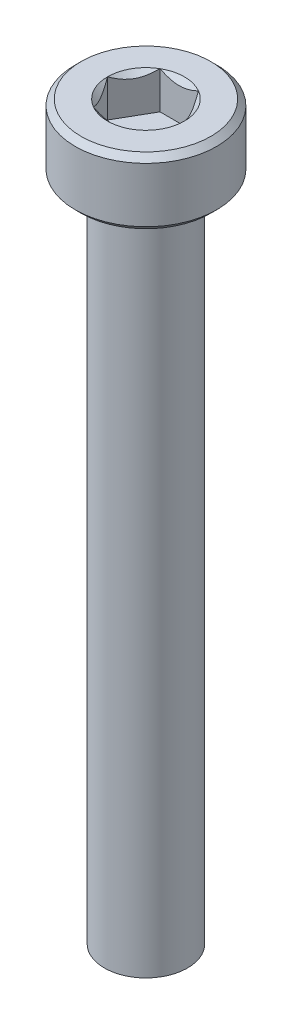
ISO-10303-21;
HEADER;
FILE_DESCRIPTION(('STEP AP214'),'2;1');
FILE_NAME('part.step','',(''),(''),'','','');
FILE_SCHEMA(('AUTOMOTIVE_DESIGN { 1 0 10303 214 1 1 1 1 }'));
ENDSEC;
DATA;
#1=APPLICATION_CONTEXT('core data for automotive mechanical design processes');
#2=APPLICATION_PROTOCOL_DEFINITION('international standard','automotive_design',2000,#1);
#3=PRODUCT_CONTEXT('',#1,'mechanical');
#4=PRODUCT('Part','Part','',(#3));
#5=PRODUCT_RELATED_PRODUCT_CATEGORY('part','',(#4));
#6=PRODUCT_DEFINITION_FORMATION('','',#4);
#7=PRODUCT_DEFINITION_CONTEXT('part definition',#1,'design');
#8=PRODUCT_DEFINITION('design','',#6,#7);
#9=PRODUCT_DEFINITION_SHAPE('','',#8);
#10=(LENGTH_UNIT() NAMED_UNIT(*) SI_UNIT(.MILLI.,.METRE.));
#11=(NAMED_UNIT(*) PLANE_ANGLE_UNIT() SI_UNIT($,.RADIAN.));
#12=(NAMED_UNIT(*) SI_UNIT($,.STERADIAN.) SOLID_ANGLE_UNIT());
#13=UNCERTAINTY_MEASURE_WITH_UNIT(LENGTH_MEASURE(1.E-05),#10,'distance_accuracy_value','');
#14=(GEOMETRIC_REPRESENTATION_CONTEXT(3) GLOBAL_UNCERTAINTY_ASSIGNED_CONTEXT((#13)) GLOBAL_UNIT_ASSIGNED_CONTEXT((#10,
#11,#12)) REPRESENTATION_CONTEXT('',''));
#15=CARTESIAN_POINT('',(0.,0.,0.));
#16=DIRECTION('',(0.,0.,1.));
#17=DIRECTION('',(1.,0.,0.));
#18=AXIS2_PLACEMENT_3D('',#15,#16,#17);
#19=CARTESIAN_POINT('',(0.,4.,0.));
#20=DIRECTION('',(0.,-1.,0.));
#21=DIRECTION('',(0.,0.,-1.));
#22=AXIS2_PLACEMENT_3D('',#19,#20,#21);
#23=CYLINDRICAL_SURFACE('',#22,4.25);
#24=CARTESIAN_POINT('',(0.,0.35,0.));
#25=DIRECTION('',(0.,1.,0.));
#26=DIRECTION('',(0.,0.,1.));
#27=AXIS2_PLACEMENT_3D('',#24,#25,#26);
#28=CIRCLE('',#27,4.25);
#29=CARTESIAN_POINT('',(0.,0.35,4.25));
#30=VERTEX_POINT('',#29);
#31=EDGE_CURVE('E191',#30,#30,#28,.T.);
#32=ORIENTED_EDGE('',*,*,#31,.T.);
#33=EDGE_LOOP('',(#32));
#34=FACE_BOUND('',#33,.T.);
#35=CARTESIAN_POINT('',(0.,3.65,0.));
#36=DIRECTION('',(0.,1.,0.));
#37=DIRECTION('',(0.,0.,1.));
#38=AXIS2_PLACEMENT_3D('',#35,#36,#37);
#39=CIRCLE('',#38,4.25);
#40=CARTESIAN_POINT('',(0.,3.65,4.25));
#41=VERTEX_POINT('',#40);
#42=EDGE_CURVE('E172',#41,#41,#39,.F.);
#43=ORIENTED_EDGE('',*,*,#42,.T.);
#44=EDGE_LOOP('',(#43));
#45=FACE_BOUND('',#44,.T.);
#46=ADVANCED_FACE('F33',(#34,#45),#23,.T.);
#47=CARTESIAN_POINT('',(0.,4.,0.));
#48=DIRECTION('',(0.,1.,0.));
#49=DIRECTION('',(0.,0.,1.));
#50=AXIS2_PLACEMENT_3D('',#47,#48,#49);
#51=PLANE('',#50);
#52=CARTESIAN_POINT('',(0.,4.,0.));
#53=DIRECTION('',(0.,1.,0.));
#54=DIRECTION('',(0.,0.,1.));
#55=AXIS2_PLACEMENT_3D('',#52,#53,#54);
#56=CIRCLE('',#55,3.9);
#57=CARTESIAN_POINT('',(0.,4.,3.9));
#58=VERTEX_POINT('',#57);
#59=EDGE_CURVE('E37',#58,#58,#56,.T.);
#60=ORIENTED_EDGE('',*,*,#59,.T.);
#61=EDGE_LOOP('',(#60));
#62=FACE_BOUND('',#61,.T.);
#63=CARTESIAN_POINT('',(0.,4.,0.));
#64=DIRECTION('',(0.,1.,0.));
#65=DIRECTION('',(0.,0.,1.));
#66=AXIS2_PLACEMENT_3D('',#63,#64,#65);
#67=CIRCLE('',#66,2.3094010767585);
#68=CARTESIAN_POINT('',(1.15470053837925,4.,2.));
#69=VERTEX_POINT('',#68);
#70=CARTESIAN_POINT('',(2.3094010767585,4.,0.));
#71=VERTEX_POINT('',#70);
#72=EDGE_CURVE('E48',#69,#71,#67,.T.);
#73=ORIENTED_EDGE('',*,*,#72,.F.);
#74=CARTESIAN_POINT('',(-1.15470053837925,4.,2.));
#75=VERTEX_POINT('',#74);
#76=EDGE_CURVE('E55',#75,#69,#67,.T.);
#77=ORIENTED_EDGE('',*,*,#76,.F.);
#78=CARTESIAN_POINT('',(-2.3094010767585,4.,0.));
#79=VERTEX_POINT('',#78);
#80=EDGE_CURVE('E220',#79,#75,#67,.T.);
#81=ORIENTED_EDGE('',*,*,#80,.F.);
#82=CARTESIAN_POINT('',(-1.15470053837925,4.,-2.));
#83=VERTEX_POINT('',#82);
#84=EDGE_CURVE('E270',#83,#79,#67,.T.);
#85=ORIENTED_EDGE('',*,*,#84,.F.);
#86=CARTESIAN_POINT('',(1.15470053837925,4.,-2.));
#87=VERTEX_POINT('',#86);
#88=EDGE_CURVE('E274',#87,#83,#67,.T.);
#89=ORIENTED_EDGE('',*,*,#88,.F.);
#90=EDGE_CURVE('E223',#71,#87,#67,.T.);
#91=ORIENTED_EDGE('',*,*,#90,.F.);
#92=EDGE_LOOP('',(#73,#77,#81,#85,#89,#91));
#93=FACE_BOUND('',#92,.T.);
#94=ADVANCED_FACE('F118',(#62,#93),#51,.T.);
#95=CARTESIAN_POINT('',(0.,0.,0.));
#96=DIRECTION('',(0.,1.,0.));
#97=DIRECTION('',(0.,0.,1.));
#98=AXIS2_PLACEMENT_3D('',#95,#96,#97);
#99=PLANE('',#98);
#100=CARTESIAN_POINT('',(0.,0.,0.));
#101=DIRECTION('',(0.,-1.,0.));
#102=DIRECTION('',(0.,0.,-1.));
#103=AXIS2_PLACEMENT_3D('',#100,#101,#102);
#104=CIRCLE('',#103,2.5);
#105=CARTESIAN_POINT('',(0.,0.,-2.5));
#106=VERTEX_POINT('',#105);
#107=EDGE_CURVE('E11',#106,#106,#104,.T.);
#108=ORIENTED_EDGE('',*,*,#107,.F.);
#109=EDGE_LOOP('',(#108));
#110=FACE_BOUND('',#109,.T.);
#111=CARTESIAN_POINT('',(0.,0.,0.));
#112=DIRECTION('',(0.,1.,0.));
#113=DIRECTION('',(0.,0.,1.));
#114=AXIS2_PLACEMENT_3D('',#111,#112,#113);
#115=CIRCLE('',#114,3.9);
#116=CARTESIAN_POINT('',(0.,0.,3.9));
#117=VERTEX_POINT('',#116);
#118=EDGE_CURVE('E192',#117,#117,#115,.F.);
#119=ORIENTED_EDGE('',*,*,#118,.T.);
#120=EDGE_LOOP('',(#119));
#121=FACE_BOUND('',#120,.T.);
#122=ADVANCED_FACE('F115',(#110,#121),#99,.F.);
#123=CARTESIAN_POINT('',(0.,4.,0.));
#124=DIRECTION('',(0.,1.,0.));
#125=DIRECTION('',(0.,0.,1.));
#126=AXIS2_PLACEMENT_3D('',#123,#124,#125);
#127=CONICAL_SURFACE('',#126,2.3094010767585,0.78539816339745);
#128=ORIENTED_EDGE('',*,*,#88,.T.);
#129=CARTESIAN_POINT('',(-2.30879514519547,4.7451913710941,-2.));
#130=CARTESIAN_POINT('',(-2.25260483420644,4.70272936243434,-2.));
#131=CARTESIAN_POINT('',(-2.19610054826954,4.66067688200341,-2.));
#132=CARTESIAN_POINT('',(-2.08233997644141,4.57757255324399,-2.));
#133=CARTESIAN_POINT('',(-2.02508350593089,4.53652095791472,-2.));
#134=CARTESIAN_POINT('',(-1.90927566541922,4.45530804643438,-2.));
#135=CARTESIAN_POINT('',(-1.85071770008489,4.41515609122241,-2.));
#136=CARTESIAN_POINT('',(-1.73260864093249,4.3363515847231,-2.));
#137=CARTESIAN_POINT('',(-1.67305761759535,4.29769892766731,-2.));
#138=CARTESIAN_POINT('',(-1.48577916730299,4.18010979954426,-2.));
#139=CARTESIAN_POINT('',(-1.35605368916015,4.10429897318513,-2.));
#140=CARTESIAN_POINT('',(-1.09012591699501,3.96558678933234,-2.));
#141=CARTESIAN_POINT('',(-0.953947448051695,3.90264190405374,-2.));
#142=CARTESIAN_POINT('',(-0.749595808101582,3.82563304479576,-2.));
#143=CARTESIAN_POINT('',(-0.68446185868507,3.80354078810321,-2.));
#144=CARTESIAN_POINT('',(-0.552616590705859,3.76458470124845,-2.));
#145=CARTESIAN_POINT('',(-0.485905164307167,3.74772122964342,-2.));
#146=CARTESIAN_POINT('',(-0.35242076182913,3.72038115809599,-2.));
#147=CARTESIAN_POINT('',(-0.285670630070522,3.70979477255778,-2.));
#148=CARTESIAN_POINT('',(-0.151450075115658,3.69521650264193,-2.));
#149=CARTESIAN_POINT('',(-0.0839797791079536,3.69122347258728,-2.));
#150=CARTESIAN_POINT('',(0.0485458836876959,3.69013056832569,-2.));
#151=CARTESIAN_POINT('',(0.113599297040325,3.69278385991794,-2.));
#152=CARTESIAN_POINT('',(0.243151501456514,3.7042913666304,-2.));
#153=CARTESIAN_POINT('',(0.307650238204749,3.71314618217543,-2.));
#154=CARTESIAN_POINT('',(0.436718068720302,3.73672255220297,-2.));
#155=CARTESIAN_POINT('',(0.501268607918767,3.75154414683371,-2.));
#156=CARTESIAN_POINT('',(0.62895874241765,3.78626456197787,-2.));
#157=CARTESIAN_POINT('',(0.692098453289582,3.80616296494129,-2.));
#158=CARTESIAN_POINT('',(0.890618825033236,3.87621951925558,-2.));
#159=CARTESIAN_POINT('',(1.02317938217928,3.9343452676672,-2.));
#160=CARTESIAN_POINT('',(1.28208571706617,4.06358808493712,-2.));
#161=CARTESIAN_POINT('',(1.40840705860453,4.1347517736225,-2.));
#162=CARTESIAN_POINT('',(1.59098608025607,4.245808104349,-2.));
#163=CARTESIAN_POINT('',(1.64922192266561,4.28251192905768,-2.));
#164=CARTESIAN_POINT('',(1.76469412690495,4.35747121364132,-2.));
#165=CARTESIAN_POINT('',(1.82193041260228,4.39572679097645,-2.));
#166=CARTESIAN_POINT('',(1.93507003138205,4.47318936346553,-2.));
#167=CARTESIAN_POINT('',(1.99098041312104,4.51238611495078,-2.));
#168=CARTESIAN_POINT('',(2.10203689890268,4.59181712257718,-2.));
#169=CARTESIAN_POINT('',(2.15718320893172,4.63205109038507,-2.));
#170=CARTESIAN_POINT('',(2.21200957179853,4.67270997847205,-2.));
#171=B_SPLINE_CURVE_WITH_KNOTS('',3,(#129,#130,#131,#132,#133,#134,#135,#136,#137,#138,#139,
#140,#141,#142,#143,#144,#145,#146,#147,#148,#149,#150,#151,#152,#153,#154,#155,#156,#157,#158,
#159,#160,#161,#162,#163,#164,#165,#166,#167,#168,#169,#170),.UNSPECIFIED.,.F.,.F.,(4,2,2,2,2,2,
2,2,2,2,2,2,2,2,2,2,2,2,2,2,4),(0.,0.211292968403538,0.422638804079875,0.635621962722851,
0.848590068976733,1.29896262331491,1.74778530247796,1.95394639565666,2.16012162294077,
2.36257550428405,2.56499420305935,2.76000764023076,2.95503996100237,3.15348829581996,
3.35192031420439,3.78488584147103,4.2194308621905,4.42592352930545,4.63243185619172,
4.83726388732872,5.04203957897375),.UNSPECIFIED.);
#172=EDGE_CURVE('E188',#87,#83,#171,.F.);
#173=ORIENTED_EDGE('',*,*,#172,.F.);
#174=EDGE_LOOP('',(#128,#173));
#175=FACE_BOUND('',#174,.T.);
#176=ADVANCED_FACE('F96',(#175),#127,.F.);
#177=ORIENTED_EDGE('',*,*,#84,.T.);
#178=CARTESIAN_POINT('',(-1.15458506832541,4.00011547871366,-2.0002));
#179=CARTESIAN_POINT('',(-1.19427965103065,3.96045309022559,-1.93144696596929));
#180=CARTESIAN_POINT('',(-1.23463799837204,3.92311998228416,-1.86154425786449));
#181=CARTESIAN_POINT('',(-1.31693321846145,3.85476368513614,-1.71900475544956));
#182=CARTESIAN_POINT('',(-1.35887791933134,3.82377853373722,-1.64635440243464));
#183=CARTESIAN_POINT('',(-1.44345742638069,3.77070021654414,-1.49985839894603));
#184=CARTESIAN_POINT('',(-1.48607068799507,3.74847362717661,-1.4260500647537));
#185=CARTESIAN_POINT('',(-1.57223542169503,3.71422881667508,-1.27680836816473));
#186=CARTESIAN_POINT('',(-1.61578426088223,3.70218502914413,-1.20137956608185));
#187=CARTESIAN_POINT('',(-1.69083694766536,3.69131851190557,-1.07138449932892));
#188=CARTESIAN_POINT('',(-1.72224381117151,3.68970975360997,-1.01698621602989));
#189=CARTESIAN_POINT('',(-1.78500621460364,3.69241887759871,-0.908278544480304));
#190=CARTESIAN_POINT('',(-1.81636173267754,3.69673883775797,-0.853969194078659));
#191=CARTESIAN_POINT('',(-1.87877671565355,3.71105956740991,-0.74586327241066));
#192=CARTESIAN_POINT('',(-1.90983580972306,3.72106669276201,-0.692067343445206));
#193=CARTESIAN_POINT('',(-1.97141691651548,3.74621243024966,-0.585405737694424));
#194=CARTESIAN_POINT('',(-2.00193897021859,3.76135064904224,-0.532539989929285));
#195=CARTESIAN_POINT('',(-2.08012358375727,3.80629450342919,-0.397120266910154));
#196=CARTESIAN_POINT('',(-2.12730124240478,3.83948883942582,-0.315406165150521));
#197=CARTESIAN_POINT('',(-2.19667172615922,3.89552582317137,-0.195252962742198));
#198=CARTESIAN_POINT('',(-2.21953238052245,3.91521470294694,-0.155657147890823));
#199=CARTESIAN_POINT('',(-2.26483018959123,3.95638731836487,-0.0771990411121286));
#200=CARTESIAN_POINT('',(-2.28726759416161,3.97786995165125,-0.0383363164062609));
#201=CARTESIAN_POINT('',(-2.30951654681234,4.00011547871366,0.000199999999998398));
#202=B_SPLINE_CURVE_WITH_KNOTS('',3,(#178,#179,#180,#181,#182,#183,#184,#185,#186,#187,#188,
#189,#190,#191,#192,#193,#194,#195,#196,#197,#198,#199,#200,#201),.UNSPECIFIED.,.F.,.F.,(4,2,2,
2,2,2,2,2,2,2,2,4),(0.,0.266420613771064,0.534393751523389,0.798110374376916,1.06116288956937,
1.24939906803722,1.43770123566248,1.62621426093932,1.81471283831913,2.11415604834145,
2.2634717071779,2.4126962696977),.UNSPECIFIED.);
#203=EDGE_CURVE('E229',#83,#79,#202,.T.);
#204=ORIENTED_EDGE('',*,*,#203,.F.);
#205=EDGE_LOOP('',(#177,#204));
#206=FACE_BOUND('',#205,.T.);
#207=ADVANCED_FACE('F114',(#206),#127,.F.);
#208=ORIENTED_EDGE('',*,*,#80,.T.);
#209=CARTESIAN_POINT('',(-2.30951654681234,4.00011547871366,-0.000200000000001262));
#210=CARTESIAN_POINT('',(-2.26982196410711,3.96045309022559,0.0685530340307045));
#211=CARTESIAN_POINT('',(-2.22946361676572,3.92311998228416,0.138455742135511));
#212=CARTESIAN_POINT('',(-2.1471683966763,3.85476368513614,0.280995244550435));
#213=CARTESIAN_POINT('',(-2.10522369580642,3.82377853373722,0.353645597565357));
#214=CARTESIAN_POINT('',(-2.02064418875706,3.77070021654414,0.50014160105397));
#215=CARTESIAN_POINT('',(-1.97803092714269,3.74847362717661,0.573949935246294));
#216=CARTESIAN_POINT('',(-1.89186619344273,3.71422881667508,0.723191631835263));
#217=CARTESIAN_POINT('',(-1.84831735425552,3.70218502914413,0.798620433918151));
#218=CARTESIAN_POINT('',(-1.7732646674724,3.69131851190557,0.928615500671078));
#219=CARTESIAN_POINT('',(-1.74185780396625,3.68970975360997,0.983013783970107));
#220=CARTESIAN_POINT('',(-1.67909540053412,3.69241887759871,1.09172145551969));
#221=CARTESIAN_POINT('',(-1.64773988246021,3.69673883775797,1.14603080592134));
#222=CARTESIAN_POINT('',(-1.5853248994842,3.7110595674099,1.25413672758934));
#223=CARTESIAN_POINT('',(-1.55426580541469,3.721066692762,1.30793265655479));
#224=CARTESIAN_POINT('',(-1.49268469862228,3.74621243024966,1.41459426230557));
#225=CARTESIAN_POINT('',(-1.46216264491917,3.76135064904224,1.46746001007071));
#226=CARTESIAN_POINT('',(-1.38397803138049,3.80629450342919,1.60287973308984));
#227=CARTESIAN_POINT('',(-1.33680037273297,3.83948883942582,1.68459383484948));
#228=CARTESIAN_POINT('',(-1.26742988897853,3.89552582317137,1.8047470372578));
#229=CARTESIAN_POINT('',(-1.24456923461531,3.91521470294694,1.84434285210918));
#230=CARTESIAN_POINT('',(-1.19927142554652,3.95638731836487,1.92280095888787));
#231=CARTESIAN_POINT('',(-1.17683402097614,3.97786995165125,1.96166368359374));
#232=CARTESIAN_POINT('',(-1.15458506832541,4.00011547871366,2.0002));
#233=B_SPLINE_CURVE_WITH_KNOTS('',3,(#209,#210,#211,#212,#213,#214,#215,#216,#217,#218,#219,
#220,#221,#222,#223,#224,#225,#226,#227,#228,#229,#230,#231,#232),.UNSPECIFIED.,.F.,.F.,(4,2,2,
2,2,2,2,2,2,2,2,4),(0.,0.266420613771064,0.534393751523389,0.798110374376915,1.06116288956936,
1.24939906803722,1.43770123566247,1.62621426093932,1.81471283831913,2.11415604834145,
2.26347170717791,2.41269626969771),.UNSPECIFIED.);
#234=EDGE_CURVE('E235',#79,#75,#233,.T.);
#235=ORIENTED_EDGE('',*,*,#234,.F.);
#236=EDGE_LOOP('',(#208,#235));
#237=FACE_BOUND('',#236,.T.);
#238=ADVANCED_FACE('F268',(#237),#127,.F.);
#239=ORIENTED_EDGE('',*,*,#76,.T.);
#240=CARTESIAN_POINT('',(-2.30879514519547,4.7451913710941,2.));
#241=CARTESIAN_POINT('',(-2.25260483420644,4.70272936243434,2.));
#242=CARTESIAN_POINT('',(-2.19610054826953,4.66067688200341,2.));
#243=CARTESIAN_POINT('',(-2.0823399764414,4.57757255324399,2.));
#244=CARTESIAN_POINT('',(-2.02508350593089,4.53652095791471,2.));
#245=CARTESIAN_POINT('',(-1.90927566541922,4.45530804643438,2.));
#246=CARTESIAN_POINT('',(-1.85071770008489,4.41515609122241,2.));
#247=CARTESIAN_POINT('',(-1.73260864093249,4.3363515847231,2.));
#248=CARTESIAN_POINT('',(-1.67305761759535,4.29769892766731,2.));
#249=CARTESIAN_POINT('',(-1.48577916730299,4.18010979954426,2.));
#250=CARTESIAN_POINT('',(-1.35605368916015,4.10429897318513,2.));
#251=CARTESIAN_POINT('',(-1.09012591699501,3.96558678933234,2.));
#252=CARTESIAN_POINT('',(-0.953947448051694,3.90264190405374,2.));
#253=CARTESIAN_POINT('',(-0.749595808101582,3.82563304479576,2.));
#254=CARTESIAN_POINT('',(-0.68446185868507,3.80354078810321,2.));
#255=CARTESIAN_POINT('',(-0.552616590705859,3.76458470124845,2.));
#256=CARTESIAN_POINT('',(-0.485905164307167,3.74772122964342,2.));
#257=CARTESIAN_POINT('',(-0.352420761829129,3.72038115809599,2.));
#258=CARTESIAN_POINT('',(-0.285670630070522,3.70979477255778,2.));
#259=CARTESIAN_POINT('',(-0.151450075115657,3.69521650264193,2.));
#260=CARTESIAN_POINT('',(-0.0839797791079529,3.69122347258728,2.));
#261=CARTESIAN_POINT('',(0.0485458836876966,3.69013056832569,2.));
#262=CARTESIAN_POINT('',(0.113599297040325,3.69278385991794,2.));
#263=CARTESIAN_POINT('',(0.243151501456515,3.7042913666304,2.));
#264=CARTESIAN_POINT('',(0.307650238204749,3.71314618217543,2.));
#265=CARTESIAN_POINT('',(0.436718068720302,3.73672255220297,2.));
#266=CARTESIAN_POINT('',(0.501268607918768,3.75154414683371,2.));
#267=CARTESIAN_POINT('',(0.62895874241765,3.78626456197787,2.));
#268=CARTESIAN_POINT('',(0.692098453289583,3.80616296494129,2.));
#269=CARTESIAN_POINT('',(0.890618825033236,3.87621951925558,2.));
#270=CARTESIAN_POINT('',(1.02317938217928,3.9343452676672,2.));
#271=CARTESIAN_POINT('',(1.28208571706617,4.06358808493712,2.));
#272=CARTESIAN_POINT('',(1.40840705860453,4.1347517736225,2.));
#273=CARTESIAN_POINT('',(1.59098608025607,4.24580810434899,2.));
#274=CARTESIAN_POINT('',(1.64922192266561,4.28251192905768,2.));
#275=CARTESIAN_POINT('',(1.76469412690495,4.35747121364132,2.));
#276=CARTESIAN_POINT('',(1.82193041260228,4.39572679097644,2.));
#277=CARTESIAN_POINT('',(1.93507003138205,4.47318936346553,2.));
#278=CARTESIAN_POINT('',(1.99098041312104,4.51238611495078,2.));
#279=CARTESIAN_POINT('',(2.10203689890268,4.59181712257718,2.));
#280=CARTESIAN_POINT('',(2.15718320893172,4.63205109038507,2.));
#281=CARTESIAN_POINT('',(2.21200957179853,4.67270997847205,2.));
#282=B_SPLINE_CURVE_WITH_KNOTS('',3,(#240,#241,#242,#243,#244,#245,#246,#247,#248,#249,#250,
#251,#252,#253,#254,#255,#256,#257,#258,#259,#260,#261,#262,#263,#264,#265,#266,#267,#268,#269,
#270,#271,#272,#273,#274,#275,#276,#277,#278,#279,#280,#281),.UNSPECIFIED.,.F.,.F.,(4,2,2,2,2,2,
2,2,2,2,2,2,2,2,2,2,2,2,2,2,4),(0.,0.211292968403538,0.422638804079876,0.63562196272285,
0.848590068976733,1.29896262331491,1.74778530247796,1.95394639565666,2.16012162294077,
2.36257550428405,2.56499420305935,2.76000764023076,2.95503996100237,3.15348829581996,
3.35192031420438,3.78488584147103,4.2194308621905,4.42592352930545,4.63243185619172,
4.83726388732871,5.04203957897375),.UNSPECIFIED.);
#283=EDGE_CURVE('E254',#75,#69,#282,.T.);
#284=ORIENTED_EDGE('',*,*,#283,.F.);
#285=EDGE_LOOP('',(#239,#284));
#286=FACE_BOUND('',#285,.T.);
#287=ADVANCED_FACE('F267',(#286),#127,.F.);
#288=ORIENTED_EDGE('',*,*,#72,.T.);
#289=CARTESIAN_POINT('',(1.15458506832541,4.00011547871366,2.0002));
#290=CARTESIAN_POINT('',(1.19427965103064,3.96045309022559,1.93144696596929));
#291=CARTESIAN_POINT('',(1.23463799837204,3.92311998228416,1.86154425786449));
#292=CARTESIAN_POINT('',(1.31693321846145,3.85476368513614,1.71900475544956));
#293=CARTESIAN_POINT('',(1.35887791933134,3.82377853373722,1.64635440243464));
#294=CARTESIAN_POINT('',(1.44345742638069,3.77070021654414,1.49985839894603));
#295=CARTESIAN_POINT('',(1.48607068799507,3.74847362717661,1.42605006475371));
#296=CARTESIAN_POINT('',(1.57223542169503,3.71422881667508,1.27680836816474));
#297=CARTESIAN_POINT('',(1.61578426088223,3.70218502914413,1.20137956608185));
#298=CARTESIAN_POINT('',(1.69083694766536,3.69131851190557,1.07138449932892));
#299=CARTESIAN_POINT('',(1.72224381117151,3.68970975360997,1.01698621602989));
#300=CARTESIAN_POINT('',(1.78500621460364,3.69241887759871,0.908278544480306));
#301=CARTESIAN_POINT('',(1.81636173267754,3.69673883775797,0.85396919407866));
#302=CARTESIAN_POINT('',(1.87877671565355,3.71105956740991,0.745863272410661));
#303=CARTESIAN_POINT('',(1.90983580972306,3.72106669276201,0.692067343445207));
#304=CARTESIAN_POINT('',(1.97141691651548,3.74621243024966,0.585405737694425));
#305=CARTESIAN_POINT('',(2.00193897021859,3.76135064904224,0.532539989929286));
#306=CARTESIAN_POINT('',(2.08012358375727,3.80629450342919,0.397120266910155));
#307=CARTESIAN_POINT('',(2.12730124240478,3.83948883942582,0.315406165150521));
#308=CARTESIAN_POINT('',(2.19667172615922,3.89552582317137,0.195252962742197));
#309=CARTESIAN_POINT('',(2.21953238052245,3.91521470294694,0.155657147890823));
#310=CARTESIAN_POINT('',(2.26483018959124,3.95638731836487,0.0771990411121278));
#311=CARTESIAN_POINT('',(2.28726759416161,3.97786995165125,0.0383363164062597));
#312=CARTESIAN_POINT('',(2.30951654681234,4.00011547871366,-0.000200000000000139));
#313=B_SPLINE_CURVE_WITH_KNOTS('',3,(#289,#290,#291,#292,#293,#294,#295,#296,#297,#298,#299,
#300,#301,#302,#303,#304,#305,#306,#307,#308,#309,#310,#311,#312),.UNSPECIFIED.,.F.,.F.,(4,2,2,
2,2,2,2,2,2,2,2,4),(0.,0.266420613771064,0.534393751523389,0.798110374376915,1.06116288956936,
1.24939906803722,1.43770123566248,1.62621426093932,1.81471283831913,2.11415604834145,
2.2634717071779,2.41269626969771),.UNSPECIFIED.);
#314=EDGE_CURVE('E145',#69,#71,#313,.T.);
#315=ORIENTED_EDGE('',*,*,#314,.F.);
#316=EDGE_LOOP('',(#288,#315));
#317=FACE_BOUND('',#316,.T.);
#318=ADVANCED_FACE('F111',(#317),#127,.F.);
#319=ORIENTED_EDGE('',*,*,#90,.T.);
#320=CARTESIAN_POINT('',(2.30951654681234,4.00011547871366,0.000199999999999522));
#321=CARTESIAN_POINT('',(2.26982196410711,3.96045309022559,-0.0685530340307061));
#322=CARTESIAN_POINT('',(2.22946361676572,3.92311998228416,-0.138455742135512));
#323=CARTESIAN_POINT('',(2.1471683966763,3.85476368513614,-0.280995244550437));
#324=CARTESIAN_POINT('',(2.10522369580642,3.82377853373722,-0.353645597565359));
#325=CARTESIAN_POINT('',(2.02064418875706,3.77070021654414,-0.500141601053972));
#326=CARTESIAN_POINT('',(1.97803092714269,3.74847362717661,-0.573949935246295));
#327=CARTESIAN_POINT('',(1.89186619344273,3.71422881667508,-0.723191631835264));
#328=CARTESIAN_POINT('',(1.84831735425552,3.70218502914413,-0.798620433918152));
#329=CARTESIAN_POINT('',(1.7732646674724,3.69131851190557,-0.928615500671079));
#330=CARTESIAN_POINT('',(1.74185780396625,3.68970975360997,-0.983013783970109));
#331=CARTESIAN_POINT('',(1.67909540053412,3.69241887759871,-1.09172145551969));
#332=CARTESIAN_POINT('',(1.64773988246021,3.69673883775797,-1.14603080592134));
#333=CARTESIAN_POINT('',(1.5853248994842,3.71105956740991,-1.25413672758934));
#334=CARTESIAN_POINT('',(1.55426580541469,3.72106669276201,-1.30793265655479));
#335=CARTESIAN_POINT('',(1.49268469862228,3.74621243024966,-1.41459426230557));
#336=CARTESIAN_POINT('',(1.46216264491917,3.76135064904224,-1.46746001007071));
#337=CARTESIAN_POINT('',(1.38397803138049,3.80629450342919,-1.60287973308984));
#338=CARTESIAN_POINT('',(1.33680037273297,3.83948883942582,-1.68459383484948));
#339=CARTESIAN_POINT('',(1.26742988897853,3.89552582317137,-1.8047470372578));
#340=CARTESIAN_POINT('',(1.24456923461531,3.91521470294694,-1.84434285210918));
#341=CARTESIAN_POINT('',(1.19927142554652,3.95638731836487,-1.92280095888787));
#342=CARTESIAN_POINT('',(1.17683402097614,3.97786995165125,-1.96166368359374));
#343=CARTESIAN_POINT('',(1.15458506832541,4.00011547871366,-2.0002));
#344=B_SPLINE_CURVE_WITH_KNOTS('',3,(#320,#321,#322,#323,#324,#325,#326,#327,#328,#329,#330,
#331,#332,#333,#334,#335,#336,#337,#338,#339,#340,#341,#342,#343),.UNSPECIFIED.,.F.,.F.,(4,2,2,
2,2,2,2,2,2,2,2,4),(0.,0.266420613771064,0.534393751523388,0.798110374376914,1.06116288956936,
1.24939906803722,1.43770123566247,1.62621426093932,1.81471283831913,2.11415604834145,
2.2634717071779,2.41269626969771),.UNSPECIFIED.);
#345=EDGE_CURVE('E137',#71,#87,#344,.T.);
#346=ORIENTED_EDGE('',*,*,#345,.F.);
#347=EDGE_LOOP('',(#319,#346));
#348=FACE_BOUND('',#347,.T.);
#349=ADVANCED_FACE('F95',(#348),#127,.F.);
#350=CARTESIAN_POINT('',(0.,1.75,0.));
#351=DIRECTION('',(0.,1.,0.));
#352=DIRECTION('',(0.,0.,1.));
#353=AXIS2_PLACEMENT_3D('',#350,#351,#352);
#354=PLANE('',#353);
#355=CARTESIAN_POINT('',(0.,1.75,0.));
#356=DIRECTION('',(0.,1.,0.));
#357=DIRECTION('',(0.,0.,1.));
#358=AXIS2_PLACEMENT_3D('',#355,#356,#357);
#359=CIRCLE('',#358,0.059401076758495);
#360=CARTESIAN_POINT('',(0.,1.75,0.059401076758495));
#361=VERTEX_POINT('',#360);
#362=EDGE_CURVE('E186',#361,#361,#359,.T.);
#363=ORIENTED_EDGE('',*,*,#362,.F.);
#364=EDGE_LOOP('',(#363));
#365=FACE_BOUND('',#364,.T.);
#366=DIRECTION('',(-0.5,0.,-0.866025403784439));
#367=VECTOR('',#366,1.);
#368=CARTESIAN_POINT('',(2.3094010767585,1.75,0.));
#369=LINE('',#368,#367);
#370=CARTESIAN_POINT('',(2.3094010767585,1.75,0.));
#371=VERTEX_POINT('',#370);
#372=CARTESIAN_POINT('',(1.15470053837925,1.75,-2.));
#373=VERTEX_POINT('',#372);
#374=EDGE_CURVE('E144',#371,#373,#369,.T.);
#375=ORIENTED_EDGE('',*,*,#374,.T.);
#376=DIRECTION('',(-1.,0.,0.));
#377=VECTOR('',#376,1.);
#378=CARTESIAN_POINT('',(1.15470053837925,1.75,-2.));
#379=LINE('',#378,#377);
#380=CARTESIAN_POINT('',(-1.15470053837925,1.75,-2.));
#381=VERTEX_POINT('',#380);
#382=EDGE_CURVE('E153',#373,#381,#379,.T.);
#383=ORIENTED_EDGE('',*,*,#382,.T.);
#384=DIRECTION('',(-0.5,0.,0.866025403784439));
#385=VECTOR('',#384,1.);
#386=CARTESIAN_POINT('',(-1.15470053837925,1.75,-2.));
#387=LINE('',#386,#385);
#388=CARTESIAN_POINT('',(-2.3094010767585,1.75,0.));
#389=VERTEX_POINT('',#388);
#390=EDGE_CURVE('E156',#381,#389,#387,.T.);
#391=ORIENTED_EDGE('',*,*,#390,.T.);
#392=DIRECTION('',(0.5,0.,0.866025403784439));
#393=VECTOR('',#392,1.);
#394=CARTESIAN_POINT('',(-2.3094010767585,1.75,0.));
#395=LINE('',#394,#393);
#396=CARTESIAN_POINT('',(-1.15470053837925,1.75,2.));
#397=VERTEX_POINT('',#396);
#398=EDGE_CURVE('E159',#389,#397,#395,.T.);
#399=ORIENTED_EDGE('',*,*,#398,.T.);
#400=DIRECTION('',(1.,0.,0.));
#401=VECTOR('',#400,1.);
#402=CARTESIAN_POINT('',(-1.15470053837925,1.75,2.));
#403=LINE('',#402,#401);
#404=CARTESIAN_POINT('',(1.15470053837925,1.75,2.));
#405=VERTEX_POINT('',#404);
#406=EDGE_CURVE('E162',#397,#405,#403,.T.);
#407=ORIENTED_EDGE('',*,*,#406,.T.);
#408=DIRECTION('',(0.5,0.,-0.866025403784439));
#409=VECTOR('',#408,1.);
#410=CARTESIAN_POINT('',(1.15470053837925,1.75,2.));
#411=LINE('',#410,#409);
#412=EDGE_CURVE('E165',#405,#371,#411,.T.);
#413=ORIENTED_EDGE('',*,*,#412,.T.);
#414=EDGE_LOOP('',(#375,#383,#391,#399,#407,#413));
#415=FACE_BOUND('',#414,.T.);
#416=ADVANCED_FACE('F110',(#365,#415),#354,.T.);
#417=CARTESIAN_POINT('',(1.15470053837925,1.75,-2.));
#418=DIRECTION('',(0.,0.,-1.));
#419=DIRECTION('',(-1.,0.,0.));
#420=AXIS2_PLACEMENT_3D('',#417,#418,#419);
#421=PLANE('',#420);
#422=DIRECTION('',(0.,1.,0.));
#423=VECTOR('',#422,1.);
#424=CARTESIAN_POINT('',(1.15470053837925,1.75,-2.));
#425=LINE('',#424,#423);
#426=EDGE_CURVE('E168',#373,#87,#425,.T.);
#427=ORIENTED_EDGE('',*,*,#426,.T.);
#428=ORIENTED_EDGE('',*,*,#172,.T.);
#429=DIRECTION('',(0.,1.,0.));
#430=VECTOR('',#429,1.);
#431=CARTESIAN_POINT('',(-1.15470053837925,1.75,-2.));
#432=LINE('',#431,#430);
#433=EDGE_CURVE('E181',#381,#83,#432,.T.);
#434=ORIENTED_EDGE('',*,*,#433,.F.);
#435=ORIENTED_EDGE('',*,*,#382,.F.);
#436=EDGE_LOOP('',(#427,#428,#434,#435));
#437=FACE_BOUND('',#436,.T.);
#438=ADVANCED_FACE('F133',(#437),#421,.F.);
#439=CARTESIAN_POINT('',(-1.15470053837925,1.75,-2.));
#440=DIRECTION('',(-0.866025403784439,0.,-0.5));
#441=DIRECTION('',(-0.5,0.,0.866025403784439));
#442=AXIS2_PLACEMENT_3D('',#439,#440,#441);
#443=PLANE('',#442);
#444=ORIENTED_EDGE('',*,*,#433,.T.);
#445=ORIENTED_EDGE('',*,*,#203,.T.);
#446=DIRECTION('',(0.,1.,0.));
#447=VECTOR('',#446,1.);
#448=CARTESIAN_POINT('',(-2.3094010767585,1.75,0.));
#449=LINE('',#448,#447);
#450=EDGE_CURVE('E178',#389,#79,#449,.T.);
#451=ORIENTED_EDGE('',*,*,#450,.F.);
#452=ORIENTED_EDGE('',*,*,#390,.F.);
#453=EDGE_LOOP('',(#444,#445,#451,#452));
#454=FACE_BOUND('',#453,.T.);
#455=ADVANCED_FACE('F240',(#454),#443,.F.);
#456=CARTESIAN_POINT('',(-2.3094010767585,1.75,0.));
#457=DIRECTION('',(-0.866025403784439,0.,0.5));
#458=DIRECTION('',(0.5,0.,0.866025403784439));
#459=AXIS2_PLACEMENT_3D('',#456,#457,#458);
#460=PLANE('',#459);
#461=ORIENTED_EDGE('',*,*,#450,.T.);
#462=ORIENTED_EDGE('',*,*,#234,.T.);
#463=DIRECTION('',(0.,1.,0.));
#464=VECTOR('',#463,1.);
#465=CARTESIAN_POINT('',(-1.15470053837925,1.75,2.));
#466=LINE('',#465,#464);
#467=EDGE_CURVE('E176',#397,#75,#466,.T.);
#468=ORIENTED_EDGE('',*,*,#467,.F.);
#469=ORIENTED_EDGE('',*,*,#398,.F.);
#470=EDGE_LOOP('',(#461,#462,#468,#469));
#471=FACE_BOUND('',#470,.T.);
#472=ADVANCED_FACE('F243',(#471),#460,.F.);
#473=CARTESIAN_POINT('',(-1.15470053837925,1.75,2.));
#474=DIRECTION('',(0.,0.,1.));
#475=DIRECTION('',(1.,0.,0.));
#476=AXIS2_PLACEMENT_3D('',#473,#474,#475);
#477=PLANE('',#476);
#478=ORIENTED_EDGE('',*,*,#467,.T.);
#479=ORIENTED_EDGE('',*,*,#283,.T.);
#480=DIRECTION('',(0.,1.,0.));
#481=VECTOR('',#480,1.);
#482=CARTESIAN_POINT('',(1.15470053837925,1.75,2.));
#483=LINE('',#482,#481);
#484=EDGE_CURVE('E173',#405,#69,#483,.T.);
#485=ORIENTED_EDGE('',*,*,#484,.F.);
#486=ORIENTED_EDGE('',*,*,#406,.F.);
#487=EDGE_LOOP('',(#478,#479,#485,#486));
#488=FACE_BOUND('',#487,.T.);
#489=ADVANCED_FACE('F248',(#488),#477,.F.);
#490=CARTESIAN_POINT('',(1.15470053837925,1.75,2.));
#491=DIRECTION('',(0.866025403784439,0.,0.5));
#492=DIRECTION('',(0.5,0.,-0.866025403784439));
#493=AXIS2_PLACEMENT_3D('',#490,#491,#492);
#494=PLANE('',#493);
#495=ORIENTED_EDGE('',*,*,#484,.T.);
#496=ORIENTED_EDGE('',*,*,#314,.T.);
#497=DIRECTION('',(0.,1.,0.));
#498=VECTOR('',#497,1.);
#499=CARTESIAN_POINT('',(2.3094010767585,1.75,0.));
#500=LINE('',#499,#498);
#501=EDGE_CURVE('E169',#371,#71,#500,.T.);
#502=ORIENTED_EDGE('',*,*,#501,.F.);
#503=ORIENTED_EDGE('',*,*,#412,.F.);
#504=EDGE_LOOP('',(#495,#496,#502,#503));
#505=FACE_BOUND('',#504,.T.);
#506=ADVANCED_FACE('F102',(#505),#494,.F.);
#507=CARTESIAN_POINT('',(2.3094010767585,1.75,0.));
#508=DIRECTION('',(0.866025403784439,0.,-0.5));
#509=DIRECTION('',(-0.5,0.,-0.866025403784439));
#510=AXIS2_PLACEMENT_3D('',#507,#508,#509);
#511=PLANE('',#510);
#512=ORIENTED_EDGE('',*,*,#501,.T.);
#513=ORIENTED_EDGE('',*,*,#345,.T.);
#514=ORIENTED_EDGE('',*,*,#426,.F.);
#515=ORIENTED_EDGE('',*,*,#374,.F.);
#516=EDGE_LOOP('',(#512,#513,#514,#515));
#517=FACE_BOUND('',#516,.T.);
#518=ADVANCED_FACE('F92',(#517),#511,.F.);
#519=ORIENTED_EDGE('',*,*,#362,.T.);
#520=EDGE_LOOP('',(#519));
#521=FACE_BOUND('',#520,.T.);
#522=CARTESIAN_POINT('',(0.,1.69059892324151,0.));
#523=VERTEX_POINT('',#522);
#524=VERTEX_LOOP('',#523);
#525=FACE_BOUND('',#524,.T.);
#526=ADVANCED_FACE('F89',(#521,#525),#127,.F.);
#527=CARTESIAN_POINT('',(0.,0.35,0.));
#528=DIRECTION('',(0.,1.,0.));
#529=DIRECTION('',(0.,0.,1.));
#530=AXIS2_PLACEMENT_3D('',#527,#528,#529);
#531=CONICAL_SURFACE('',#530,4.25,0.78539816339745);
#532=CARTESIAN_POINT('',(0.,0.,3.9));
#533=CARTESIAN_POINT('',(0.,0.00364583333333348,3.90364583333333));
#534=CARTESIAN_POINT('',(0.,0.00729166666666674,3.90729166666667));
#535=CARTESIAN_POINT('',(0.,0.0145833333333333,3.91458333333333));
#536=CARTESIAN_POINT('',(0.,0.0182291666666665,3.91822916666667));
#537=CARTESIAN_POINT('',(0.,0.0255208333333332,3.92552083333333));
#538=CARTESIAN_POINT('',(0.,0.0291666666666665,3.92916666666667));
#539=CARTESIAN_POINT('',(0.,0.0364583333333333,3.93645833333333));
#540=CARTESIAN_POINT('',(0.,0.0401041666666667,3.94010416666667));
#541=CARTESIAN_POINT('',(0.,0.0473958333333333,3.94739583333333));
#542=CARTESIAN_POINT('',(0.,0.0510416666666665,3.95104166666667));
#543=CARTESIAN_POINT('',(0.,0.0583333333333331,3.95833333333333));
#544=CARTESIAN_POINT('',(0.,0.0619791666666666,3.96197916666667));
#545=CARTESIAN_POINT('',(0.,0.0692708333333333,3.96927083333333));
#546=CARTESIAN_POINT('',(0.,0.0729166666666665,3.97291666666667));
#547=CARTESIAN_POINT('',(0.,0.0802083333333331,3.98020833333333));
#548=CARTESIAN_POINT('',(0.,0.0838541666666666,3.98385416666667));
#549=CARTESIAN_POINT('',(0.,0.0911458333333333,3.99114583333333));
#550=CARTESIAN_POINT('',(0.,0.0947916666666665,3.99479166666667));
#551=CARTESIAN_POINT('',(0.,0.102083333333333,4.00208333333333));
#552=CARTESIAN_POINT('',(0.,0.105729166666666,4.00572916666667));
#553=CARTESIAN_POINT('',(0.,0.113020833333333,4.01302083333333));
#554=CARTESIAN_POINT('',(0.,0.116666666666667,4.01666666666667));
#555=CARTESIAN_POINT('',(0.,0.123958333333333,4.02395833333333));
#556=CARTESIAN_POINT('',(0.,0.127604166666666,4.02760416666667));
#557=CARTESIAN_POINT('',(0.,0.134895833333333,4.03489583333333));
#558=CARTESIAN_POINT('',(0.,0.138541666666667,4.03854166666667));
#559=CARTESIAN_POINT('',(0.,0.145833333333333,4.04583333333333));
#560=CARTESIAN_POINT('',(0.,0.149479166666666,4.04947916666667));
#561=CARTESIAN_POINT('',(0.,0.156770833333333,4.05677083333333));
#562=CARTESIAN_POINT('',(0.,0.160416666666666,4.06041666666667));
#563=CARTESIAN_POINT('',(0.,0.167708333333333,4.06770833333333));
#564=CARTESIAN_POINT('',(0.,0.171354166666667,4.07135416666667));
#565=CARTESIAN_POINT('',(0.,0.178645833333333,4.07864583333333));
#566=CARTESIAN_POINT('',(0.,0.182291666666666,4.08229166666667));
#567=CARTESIAN_POINT('',(0.,0.189583333333333,4.08958333333333));
#568=CARTESIAN_POINT('',(0.,0.193229166666666,4.09322916666667));
#569=CARTESIAN_POINT('',(0.,0.200520833333333,4.10052083333333));
#570=CARTESIAN_POINT('',(0.,0.204166666666666,4.10416666666667));
#571=CARTESIAN_POINT('',(0.,0.211458333333333,4.11145833333333));
#572=CARTESIAN_POINT('',(0.,0.215104166666666,4.11510416666667));
#573=CARTESIAN_POINT('',(0.,0.222395833333333,4.12239583333333));
#574=CARTESIAN_POINT('',(0.,0.226041666666666,4.12604166666667));
#575=CARTESIAN_POINT('',(0.,0.233333333333333,4.13333333333333));
#576=CARTESIAN_POINT('',(0.,0.236979166666666,4.13697916666667));
#577=CARTESIAN_POINT('',(0.,0.244270833333333,4.14427083333333));
#578=CARTESIAN_POINT('',(0.,0.247916666666666,4.14791666666667));
#579=CARTESIAN_POINT('',(0.,0.255208333333333,4.15520833333333));
#580=CARTESIAN_POINT('',(0.,0.258854166666666,4.15885416666667));
#581=CARTESIAN_POINT('',(0.,0.266145833333333,4.16614583333333));
#582=CARTESIAN_POINT('',(0.,0.269791666666666,4.16979166666667));
#583=CARTESIAN_POINT('',(0.,0.277083333333333,4.17708333333333));
#584=CARTESIAN_POINT('',(0.,0.280729166666666,4.18072916666667));
#585=CARTESIAN_POINT('',(0.,0.288020833333333,4.18802083333333));
#586=CARTESIAN_POINT('',(0.,0.291666666666666,4.19166666666667));
#587=CARTESIAN_POINT('',(0.,0.298958333333333,4.19895833333333));
#588=CARTESIAN_POINT('',(0.,0.302604166666666,4.20260416666667));
#589=CARTESIAN_POINT('',(0.,0.309895833333333,4.20989583333333));
#590=CARTESIAN_POINT('',(0.,0.313541666666666,4.21354166666667));
#591=CARTESIAN_POINT('',(0.,0.320833333333333,4.22083333333333));
#592=CARTESIAN_POINT('',(0.,0.324479166666666,4.22447916666667));
#593=CARTESIAN_POINT('',(0.,0.331770833333333,4.23177083333333));
#594=CARTESIAN_POINT('',(0.,0.335416666666666,4.23541666666667));
#595=CARTESIAN_POINT('',(0.,0.342708333333333,4.24270833333333));
#596=CARTESIAN_POINT('',(0.,0.346354166666666,4.24635416666667));
#597=CARTESIAN_POINT('',(0.,0.35,4.25));
#598=B_SPLINE_CURVE_WITH_KNOTS('',3,(#532,#533,#534,#535,#536,#537,#538,#539,#540,#541,#542,
#543,#544,#545,#546,#547,#548,#549,#550,#551,#552,#553,#554,#555,#556,#557,#558,#559,#560,#561,
#562,#563,#564,#565,#566,#567,#568,#569,#570,#571,#572,#573,#574,#575,#576,#577,#578,#579,#580,
#581,#582,#583,#584,#585,#586,#587,#588,#589,#590,#591,#592,#593,#594,#595,#596,#597),
.UNSPECIFIED.,.F.,.F.,(4,2,2,2,2,2,2,2,2,2,2,2,2,2,2,2,2,2,2,2,2,2,2,2,2,2,2,2,2,2,2,2,4),(0.,
0.0154679608384555,0.0309359216769116,0.0464038825153671,0.0618718433538225,0.0773398041922786,
0.0928077650307341,0.10827572586919,0.123743686707646,0.139211647546102,0.154679608384557,
0.170147569223013,0.185615530061469,0.201083490899924,0.21655145173838,0.232019412576836,
0.247487373415291,0.262955334253747,0.278423295092203,0.293891255930659,0.309359216769114,
0.32482717760757,0.340295138446026,0.355763099284482,0.371231060122938,0.386699020961393,
0.402166981799849,0.417634942638305,0.43310290347676,0.448570864315216,0.464038825153672,
0.479506785992128,0.494974746830583),.UNSPECIFIED.);
#599=EDGE_CURVE('BSEAM91',#117,#30,#598,.T.);
#600=ORIENTED_EDGE('',*,*,#118,.F.);
#601=ORIENTED_EDGE('',*,*,#31,.F.);
#602=ORIENTED_EDGE('',*,*,#599,.T.);
#603=ORIENTED_EDGE('',*,*,#599,.F.);
#604=EDGE_LOOP('',(#600,#602,#601,#603));
#605=FACE_BOUND('',#604,.T.);
#606=ADVANCED_FACE('F91',(#605),#531,.T.);
#607=CARTESIAN_POINT('',(0.,4.,0.));
#608=DIRECTION('',(0.,-1.,0.));
#609=DIRECTION('',(0.,0.,-1.));
#610=AXIS2_PLACEMENT_3D('',#607,#608,#609);
#611=CONICAL_SURFACE('',#610,3.9,0.785398163397448);
#612=ORIENTED_EDGE('',*,*,#42,.F.);
#613=EDGE_LOOP('',(#612));
#614=FACE_BOUND('',#613,.T.);
#615=ORIENTED_EDGE('',*,*,#59,.F.);
#616=EDGE_LOOP('',(#615));
#617=FACE_BOUND('',#616,.T.);
#618=ADVANCED_FACE('F35',(#614,#617),#611,.T.);
#619=CARTESIAN_POINT('',(0.,-40.,0.));
#620=DIRECTION('',(0.,1.,0.));
#621=DIRECTION('',(0.,0.,1.));
#622=AXIS2_PLACEMENT_3D('',#619,#620,#621);
#623=CYLINDRICAL_SURFACE('',#622,2.5);
#624=CARTESIAN_POINT('',(0.,-40.,0.));
#625=DIRECTION('',(0.,-1.,0.));
#626=DIRECTION('',(0.,0.,-1.));
#627=AXIS2_PLACEMENT_3D('',#624,#625,#626);
#628=CIRCLE('',#627,2.5);
#629=CARTESIAN_POINT('',(0.,-40.,-2.5));
#630=VERTEX_POINT('',#629);
#631=EDGE_CURVE('E217',#630,#630,#628,.T.);
#632=ORIENTED_EDGE('',*,*,#631,.F.);
#633=EDGE_LOOP('',(#632));
#634=FACE_BOUND('',#633,.T.);
#635=ORIENTED_EDGE('',*,*,#107,.T.);
#636=EDGE_LOOP('',(#635));
#637=FACE_BOUND('',#636,.T.);
#638=ADVANCED_FACE('F201',(#634,#637),#623,.T.);
#639=CARTESIAN_POINT('',(0.,-40.,0.));
#640=DIRECTION('',(0.,-1.,0.));
#641=DIRECTION('',(0.,0.,-1.));
#642=AXIS2_PLACEMENT_3D('',#639,#640,#641);
#643=PLANE('',#642);
#644=ORIENTED_EDGE('',*,*,#631,.T.);
#645=EDGE_LOOP('',(#644));
#646=FACE_BOUND('',#645,.T.);
#647=ADVANCED_FACE('F206',(#646),#643,.T.);
#648=CLOSED_SHELL('',(#46,#94,#122,#176,#207,#238,#287,#318,#349,#416,#438,#455,#472,#489,#506,
#518,#526,#606,#618,#638,#647));
#649=MANIFOLD_SOLID_BREP('B2',#648);
#650=ADVANCED_BREP_SHAPE_REPRESENTATION('',(#18,#649),#14);
#651=SHAPE_DEFINITION_REPRESENTATION(#9,#650);
ENDSEC;
END-ISO-10303-21;
